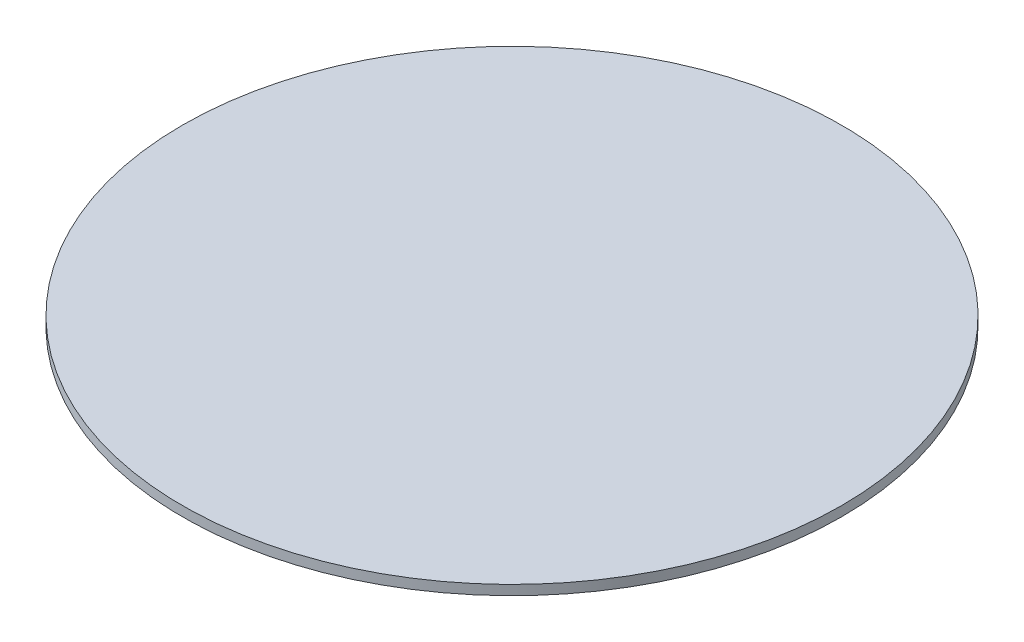
ISO-10303-21;
HEADER;
FILE_DESCRIPTION(('STEP AP214'),'2;1');
FILE_NAME('part.step','',(''),(''),'','','');
FILE_SCHEMA(('AUTOMOTIVE_DESIGN { 1 0 10303 214 1 1 1 1 }'));
ENDSEC;
DATA;
#1=APPLICATION_CONTEXT('core data for automotive mechanical design processes');
#2=APPLICATION_PROTOCOL_DEFINITION('international standard','automotive_design',2000,#1);
#3=PRODUCT_CONTEXT('',#1,'mechanical');
#4=PRODUCT('Part','Part','',(#3));
#5=PRODUCT_RELATED_PRODUCT_CATEGORY('part','',(#4));
#6=PRODUCT_DEFINITION_FORMATION('','',#4);
#7=PRODUCT_DEFINITION_CONTEXT('part definition',#1,'design');
#8=PRODUCT_DEFINITION('design','',#6,#7);
#9=PRODUCT_DEFINITION_SHAPE('','',#8);
#10=(LENGTH_UNIT() NAMED_UNIT(*) SI_UNIT(.MILLI.,.METRE.));
#11=(NAMED_UNIT(*) PLANE_ANGLE_UNIT() SI_UNIT($,.RADIAN.));
#12=(NAMED_UNIT(*) SI_UNIT($,.STERADIAN.) SOLID_ANGLE_UNIT());
#13=UNCERTAINTY_MEASURE_WITH_UNIT(LENGTH_MEASURE(1.E-05),#10,'distance_accuracy_value','');
#14=(GEOMETRIC_REPRESENTATION_CONTEXT(3) GLOBAL_UNCERTAINTY_ASSIGNED_CONTEXT((#13)) GLOBAL_UNIT_ASSIGNED_CONTEXT((#10,
#11,#12)) REPRESENTATION_CONTEXT('',''));
#15=CARTESIAN_POINT('',(0.,0.,0.));
#16=DIRECTION('',(0.,0.,1.));
#17=DIRECTION('',(1.,0.,0.));
#18=AXIS2_PLACEMENT_3D('',#15,#16,#17);
#19=CARTESIAN_POINT('',(0.,20.5,0.));
#20=DIRECTION('',(0.,1.,0.));
#21=DIRECTION('',(-1.,0.,0.));
#22=AXIS2_PLACEMENT_3D('',#19,#20,#21);
#23=PLANE('',#22);
#24=CARTESIAN_POINT('',(0.,20.5,0.));
#25=DIRECTION('',(0.,1.,0.));
#26=DIRECTION('',(-1.,0.,0.));
#27=AXIS2_PLACEMENT_3D('',#24,#25,#26);
#28=CIRCLE('',#27,67.5);
#29=CARTESIAN_POINT('',(-67.5,20.5,0.));
#30=VERTEX_POINT('',#29);
#31=EDGE_CURVE('E10',#30,#30,#28,.T.);
#32=ORIENTED_EDGE('',*,*,#31,.T.);
#33=EDGE_LOOP('',(#32));
#34=FACE_BOUND('',#33,.T.);
#35=ADVANCED_FACE('F39',(#34),#23,.T.);
#36=CARTESIAN_POINT('',(0.,20.5,0.));
#37=DIRECTION('',(0.,1.,0.));
#38=DIRECTION('',(-1.,0.,0.));
#39=AXIS2_PLACEMENT_3D('',#36,#37,#38);
#40=CYLINDRICAL_SURFACE('',#39,67.5);
#41=CARTESIAN_POINT('',(0.,18.5,0.));
#42=DIRECTION('',(0.,1.,0.));
#43=DIRECTION('',(-1.,0.,0.));
#44=AXIS2_PLACEMENT_3D('',#41,#42,#43);
#45=CIRCLE('',#44,67.5);
#46=CARTESIAN_POINT('',(-67.5,18.5,0.));
#47=VERTEX_POINT('',#46);
#48=EDGE_CURVE('E45',#47,#47,#45,.T.);
#49=ORIENTED_EDGE('',*,*,#48,.T.);
#50=EDGE_LOOP('',(#49));
#51=FACE_BOUND('',#50,.T.);
#52=ORIENTED_EDGE('',*,*,#31,.F.);
#53=EDGE_LOOP('',(#52));
#54=FACE_BOUND('',#53,.T.);
#55=ADVANCED_FACE('F51',(#51,#54),#40,.T.);
#56=CARTESIAN_POINT('',(0.,18.5,0.));
#57=DIRECTION('',(0.,-1.,0.));
#58=DIRECTION('',(1.,0.,0.));
#59=AXIS2_PLACEMENT_3D('',#56,#57,#58);
#60=PLANE('',#59);
#61=ORIENTED_EDGE('',*,*,#48,.F.);
#62=EDGE_LOOP('',(#61));
#63=FACE_BOUND('',#62,.T.);
#64=ADVANCED_FACE('F54',(#63),#60,.T.);
#65=CLOSED_SHELL('',(#35,#55,#64));
#66=MANIFOLD_SOLID_BREP('B2',#65);
#67=ADVANCED_BREP_SHAPE_REPRESENTATION('',(#18,#66),#14);
#68=SHAPE_DEFINITION_REPRESENTATION(#9,#67);
ENDSEC;
END-ISO-10303-21;
